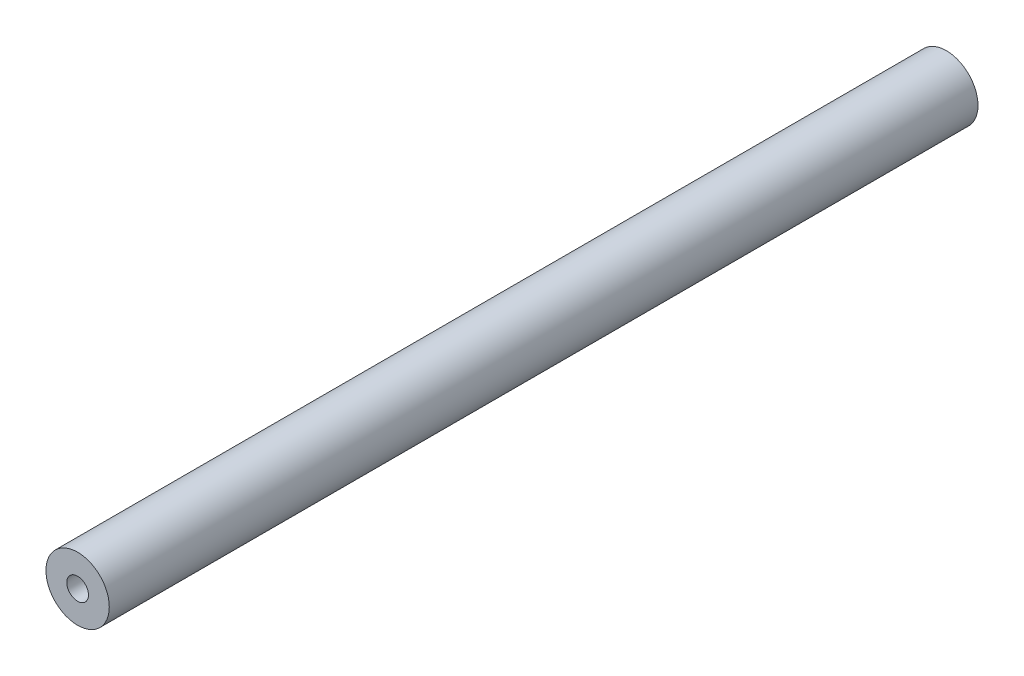
ISO-10303-21;
HEADER;
FILE_DESCRIPTION(('STEP AP214'),'2;1');
FILE_NAME('part.step','',(''),(''),'','','');
FILE_SCHEMA(('AUTOMOTIVE_DESIGN { 1 0 10303 214 1 1 1 1 }'));
ENDSEC;
DATA;
#1=APPLICATION_CONTEXT('core data for automotive mechanical design processes');
#2=APPLICATION_PROTOCOL_DEFINITION('international standard','automotive_design',2000,#1);
#3=PRODUCT_CONTEXT('',#1,'mechanical');
#4=PRODUCT('Part','Part','',(#3));
#5=PRODUCT_RELATED_PRODUCT_CATEGORY('part','',(#4));
#6=PRODUCT_DEFINITION_FORMATION('','',#4);
#7=PRODUCT_DEFINITION_CONTEXT('part definition',#1,'design');
#8=PRODUCT_DEFINITION('design','',#6,#7);
#9=PRODUCT_DEFINITION_SHAPE('','',#8);
#10=(LENGTH_UNIT() NAMED_UNIT(*) SI_UNIT(.MILLI.,.METRE.));
#11=(NAMED_UNIT(*) PLANE_ANGLE_UNIT() SI_UNIT($,.RADIAN.));
#12=(NAMED_UNIT(*) SI_UNIT($,.STERADIAN.) SOLID_ANGLE_UNIT());
#13=UNCERTAINTY_MEASURE_WITH_UNIT(LENGTH_MEASURE(1.E-05),#10,'distance_accuracy_value','');
#14=(GEOMETRIC_REPRESENTATION_CONTEXT(3) GLOBAL_UNCERTAINTY_ASSIGNED_CONTEXT((#13)) GLOBAL_UNIT_ASSIGNED_CONTEXT((#10,
#11,#12)) REPRESENTATION_CONTEXT('',''));
#15=CARTESIAN_POINT('',(0.,0.,0.));
#16=DIRECTION('',(0.,0.,1.));
#17=DIRECTION('',(1.,0.,0.));
#18=AXIS2_PLACEMENT_3D('',#15,#16,#17);
#19=CARTESIAN_POINT('',(0.,0.,240.));
#20=DIRECTION('',(0.,0.,-1.));
#21=DIRECTION('',(-1.,0.,0.));
#22=AXIS2_PLACEMENT_3D('',#19,#20,#21);
#23=CYLINDRICAL_SURFACE('',#22,8.75);
#24=CARTESIAN_POINT('',(0.,0.,240.));
#25=DIRECTION('',(0.,0.,1.));
#26=DIRECTION('',(1.,0.,0.));
#27=AXIS2_PLACEMENT_3D('',#24,#25,#26);
#28=CIRCLE('',#27,8.75);
#29=CARTESIAN_POINT('',(8.75,0.,240.));
#30=VERTEX_POINT('',#29);
#31=EDGE_CURVE('E10',#30,#30,#28,.T.);
#32=ORIENTED_EDGE('',*,*,#31,.F.);
#33=EDGE_LOOP('',(#32));
#34=FACE_BOUND('',#33,.T.);
#35=CARTESIAN_POINT('',(0.,0.,0.));
#36=DIRECTION('',(0.,0.,1.));
#37=DIRECTION('',(1.,0.,0.));
#38=AXIS2_PLACEMENT_3D('',#35,#36,#37);
#39=CIRCLE('',#38,8.75);
#40=CARTESIAN_POINT('',(8.75,0.,0.));
#41=VERTEX_POINT('',#40);
#42=EDGE_CURVE('E34',#41,#41,#39,.T.);
#43=ORIENTED_EDGE('',*,*,#42,.T.);
#44=EDGE_LOOP('',(#43));
#45=FACE_BOUND('',#44,.T.);
#46=ADVANCED_FACE('F31',(#34,#45),#23,.T.);
#47=CARTESIAN_POINT('',(0.,0.,240.));
#48=DIRECTION('',(0.,0.,1.));
#49=DIRECTION('',(1.,0.,0.));
#50=AXIS2_PLACEMENT_3D('',#47,#48,#49);
#51=PLANE('',#50);
#52=CARTESIAN_POINT('',(0.,0.,240.));
#53=DIRECTION('',(0.,0.,1.));
#54=DIRECTION('',(1.,0.,0.));
#55=AXIS2_PLACEMENT_3D('',#52,#53,#54);
#56=CIRCLE('',#55,3.);
#57=CARTESIAN_POINT('',(3.,0.,240.));
#58=VERTEX_POINT('',#57);
#59=EDGE_CURVE('E41',#58,#58,#56,.F.);
#60=ORIENTED_EDGE('',*,*,#59,.T.);
#61=EDGE_LOOP('',(#60));
#62=FACE_BOUND('',#61,.T.);
#63=ORIENTED_EDGE('',*,*,#31,.T.);
#64=EDGE_LOOP('',(#63));
#65=FACE_BOUND('',#64,.T.);
#66=ADVANCED_FACE('F59',(#62,#65),#51,.T.);
#67=CARTESIAN_POINT('',(0.,0.,0.));
#68=DIRECTION('',(0.,0.,1.));
#69=DIRECTION('',(1.,0.,0.));
#70=AXIS2_PLACEMENT_3D('',#67,#68,#69);
#71=PLANE('',#70);
#72=CARTESIAN_POINT('',(0.,0.,0.));
#73=DIRECTION('',(0.,0.,1.));
#74=DIRECTION('',(1.,0.,0.));
#75=AXIS2_PLACEMENT_3D('',#72,#73,#74);
#76=CIRCLE('',#75,3.);
#77=CARTESIAN_POINT('',(3.,0.,0.));
#78=VERTEX_POINT('',#77);
#79=EDGE_CURVE('E45',#78,#78,#76,.T.);
#80=ORIENTED_EDGE('',*,*,#79,.T.);
#81=EDGE_LOOP('',(#80));
#82=FACE_BOUND('',#81,.T.);
#83=ORIENTED_EDGE('',*,*,#42,.F.);
#84=EDGE_LOOP('',(#83));
#85=FACE_BOUND('',#84,.T.);
#86=ADVANCED_FACE('F49',(#82,#85),#71,.F.);
#87=CARTESIAN_POINT('',(0.,0.,276.));
#88=DIRECTION('',(0.,0.,-1.));
#89=DIRECTION('',(-1.,0.,0.));
#90=AXIS2_PLACEMENT_3D('',#87,#88,#89);
#91=CYLINDRICAL_SURFACE('',#90,3.);
#92=ORIENTED_EDGE('',*,*,#59,.F.);
#93=EDGE_LOOP('',(#92));
#94=FACE_BOUND('',#93,.T.);
#95=ORIENTED_EDGE('',*,*,#79,.F.);
#96=EDGE_LOOP('',(#95));
#97=FACE_BOUND('',#96,.T.);
#98=ADVANCED_FACE('F52',(#94,#97),#91,.F.);
#99=CLOSED_SHELL('',(#46,#66,#86,#98));
#100=MANIFOLD_SOLID_BREP('B2',#99);
#101=ADVANCED_BREP_SHAPE_REPRESENTATION('',(#18,#100),#14);
#102=SHAPE_DEFINITION_REPRESENTATION(#9,#101);
ENDSEC;
END-ISO-10303-21;
